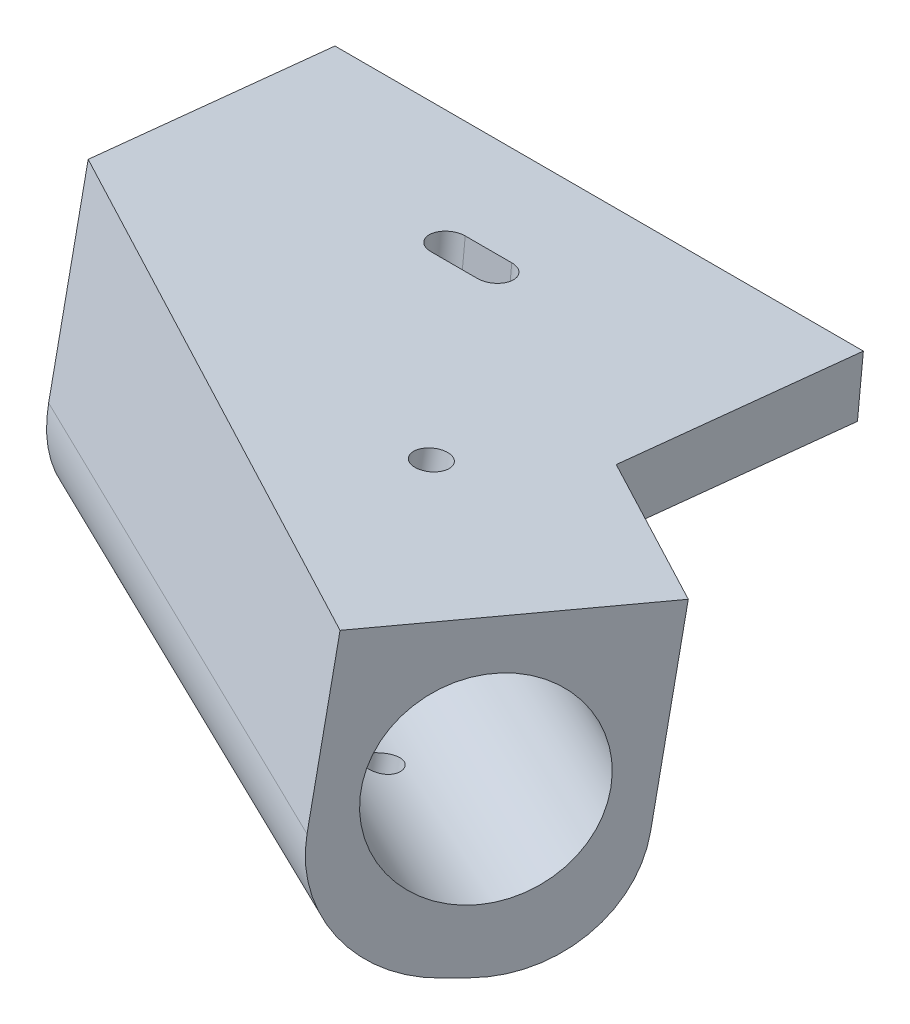
ISO-10303-21;
HEADER;
FILE_DESCRIPTION(('STEP AP214'),'2;1');
FILE_NAME('part.step','',(''),(''),'','','');
FILE_SCHEMA(('AUTOMOTIVE_DESIGN { 1 0 10303 214 1 1 1 1 }'));
ENDSEC;
DATA;
#1=APPLICATION_CONTEXT('core data for automotive mechanical design processes');
#2=APPLICATION_PROTOCOL_DEFINITION('international standard','automotive_design',2000,#1);
#3=PRODUCT_CONTEXT('',#1,'mechanical');
#4=PRODUCT('Part','Part','',(#3));
#5=PRODUCT_RELATED_PRODUCT_CATEGORY('part','',(#4));
#6=PRODUCT_DEFINITION_FORMATION('','',#4);
#7=PRODUCT_DEFINITION_CONTEXT('part definition',#1,'design');
#8=PRODUCT_DEFINITION('design','',#6,#7);
#9=PRODUCT_DEFINITION_SHAPE('','',#8);
#10=(LENGTH_UNIT() NAMED_UNIT(*) SI_UNIT(.MILLI.,.METRE.));
#11=(NAMED_UNIT(*) PLANE_ANGLE_UNIT() SI_UNIT($,.RADIAN.));
#12=(NAMED_UNIT(*) SI_UNIT($,.STERADIAN.) SOLID_ANGLE_UNIT());
#13=UNCERTAINTY_MEASURE_WITH_UNIT(LENGTH_MEASURE(1.E-05),#10,'distance_accuracy_value','');
#14=(GEOMETRIC_REPRESENTATION_CONTEXT(3) GLOBAL_UNCERTAINTY_ASSIGNED_CONTEXT((#13)) GLOBAL_UNIT_ASSIGNED_CONTEXT((#10,
#11,#12)) REPRESENTATION_CONTEXT('',''));
#15=CARTESIAN_POINT('',(0.,0.,0.));
#16=DIRECTION('',(0.,0.,1.));
#17=DIRECTION('',(1.,0.,0.));
#18=AXIS2_PLACEMENT_3D('',#15,#16,#17);
#19=CARTESIAN_POINT('',(32.8860228934979,-32.1671073067787,5.94942950250736));
#20=DIRECTION('',(-1.,0.,0.));
#21=DIRECTION('',(0.,0.202445469765825,0.979293537082368));
#22=AXIS2_PLACEMENT_3D('',#19,#20,#21);
#23=PLANE('',#22);
#24=DIRECTION('',(0.,0.101750830261066,0.994809915783505));
#25=VECTOR('',#24,1.);
#26=CARTESIAN_POINT('',(32.8860228934979,-3.35273767131856,0.34292364429795));
#27=LINE('',#26,#25);
#28=CARTESIAN_POINT('',(32.8860228934979,-2.93965703936323,4.38158070127646));
#29=VERTEX_POINT('',#28);
#30=CARTESIAN_POINT('',(32.8860228934979,-0.768702373713808,25.606834810391));
#31=VERTEX_POINT('',#30);
#32=EDGE_CURVE('E261',#29,#31,#27,.T.);
#33=ORIENTED_EDGE('',*,*,#32,.T.);
#34=DIRECTION('',(0.,0.979293537082368,-0.202445469765825));
#35=VECTOR('',#34,1.);
#36=CARTESIAN_POINT('',(32.8860228934979,-26.9831196043732,31.0260373374591));
#37=LINE('',#36,#35);
#38=CARTESIAN_POINT('',(32.8860228934979,-17.1901842335495,29.0015826398008));
#39=VERTEX_POINT('',#38);
#40=EDGE_CURVE('E331',#39,#31,#37,.T.);
#41=ORIENTED_EDGE('',*,*,#40,.F.);
#42=CARTESIAN_POINT('',(32.8860228934979,-14.8748820548213,40.2014403725721));
#43=DIRECTION('',(1.,0.,0.));
#44=DIRECTION('',(0.,0.202445469765825,0.979293537082368));
#45=AXIS2_PLACEMENT_3D('',#42,#43,#44);
#46=ELLIPSE('',#45,11.4366707311673,10.);
#47=CARTESIAN_POINT('',(32.8860228934979,-24.6678174256449,42.2258950702303));
#48=VERTEX_POINT('',#47);
#49=EDGE_CURVE('E459',#48,#39,#46,.T.);
#50=ORIENTED_EDGE('',*,*,#49,.F.);
#51=DIRECTION('',(0.,-0.202445469765825,-0.979293537082368));
#52=VECTOR('',#51,1.);
#53=CARTESIAN_POINT('',(32.8860228934979,-32.1671073067787,5.94942950250736));
#54=LINE('',#53,#52);
#55=CARTESIAN_POINT('',(32.8860228934979,-27.8092808682838,27.0296308618222));
#56=VERTEX_POINT('',#55);
#57=EDGE_CURVE('E324',#48,#56,#54,.T.);
#58=ORIENTED_EDGE('',*,*,#57,.T.);
#59=DIRECTION('',(0.,-0.994809915783505,0.101750830261066));
#60=VECTOR('',#59,1.);
#61=CARTESIAN_POINT('',(32.8860228934979,-4.25737810546047,24.6207026612445));
#62=LINE('',#61,#60);
#63=CARTESIAN_POINT('',(32.8860228934979,-5.87869001305944,24.7865331682519));
#64=VERTEX_POINT('',#63);
#65=EDGE_CURVE('E290',#64,#56,#62,.T.);
#66=ORIENTED_EDGE('',*,*,#65,.F.);
#67=DIRECTION('',(0.,0.101750830261066,0.994809915783505));
#68=VECTOR('',#67,1.);
#69=CARTESIAN_POINT('',(32.8860228934979,-8.32678725023608,0.851677795603279));
#70=LINE('',#69,#68);
#71=CARTESIAN_POINT('',(32.8860228934979,-7.91370661828075,4.89033485258179));
#72=VERTEX_POINT('',#71);
#73=EDGE_CURVE('E230',#72,#64,#70,.T.);
#74=ORIENTED_EDGE('',*,*,#73,.F.);
#75=DIRECTION('',(0.,-0.994809915783505,0.101750830261066));
#76=VECTOR('',#75,1.);
#77=CARTESIAN_POINT('',(32.8860228934979,80.6243758864512,-4.16548904065305));
#78=LINE('',#77,#76);
#79=EDGE_CURVE('E213',#29,#72,#78,.T.);
#80=ORIENTED_EDGE('',*,*,#79,.F.);
#81=EDGE_LOOP('',(#33,#41,#50,#58,#66,#74,#80));
#82=FACE_BOUND('',#81,.T.);
#83=ADVANCED_FACE('F102',(#82),#23,.F.);
#84=CARTESIAN_POINT('',(-12.5,-32.1671073067787,5.94942950250736));
#85=DIRECTION('',(-1.,0.,0.));
#86=DIRECTION('',(0.,0.202445469765825,0.979293537082368));
#87=AXIS2_PLACEMENT_3D('',#84,#85,#86);
#88=PLANE('',#87);
#89=DIRECTION('',(0.,-0.994809915783505,0.101750830261066));
#90=VECTOR('',#89,1.);
#91=CARTESIAN_POINT('',(-12.5,80.6243758864512,-4.16548904065305));
#92=LINE('',#91,#90);
#93=CARTESIAN_POINT('',(-12.5,-2.93965703936324,4.38158070127646));
#94=VERTEX_POINT('',#93);
#95=CARTESIAN_POINT('',(-12.5,-7.91370661828075,4.89033485258179));
#96=VERTEX_POINT('',#95);
#97=EDGE_CURVE('E212',#94,#96,#92,.T.);
#98=ORIENTED_EDGE('',*,*,#97,.T.);
#99=DIRECTION('',(0.,-0.101750830261066,-0.994809915783505));
#100=VECTOR('',#99,1.);
#101=CARTESIAN_POINT('',(-12.5,-8.05760323230686,3.48346890255901));
#102=LINE('',#101,#100);
#103=CARTESIAN_POINT('',(-12.5,-5.87869001305944,24.7865331682519));
#104=VERTEX_POINT('',#103);
#105=EDGE_CURVE('E221',#104,#96,#102,.T.);
#106=ORIENTED_EDGE('',*,*,#105,.F.);
#107=DIRECTION('',(0.,0.994809915783505,-0.101750830261066));
#108=VECTOR('',#107,1.);
#109=CARTESIAN_POINT('',(-12.5,-29.9881940875313,27.2524937682002));
#110=LINE('',#109,#108);
#111=CARTESIAN_POINT('',(-12.5,-25.247272851564,26.7675843756536));
#112=VERTEX_POINT('',#111);
#113=EDGE_CURVE('E229',#112,#104,#110,.T.);
#114=ORIENTED_EDGE('',*,*,#113,.F.);
#115=CARTESIAN_POINT('',(-12.5,-19.5108506111264,17.775776560197));
#116=DIRECTION('',(1.,0.,0.));
#117=DIRECTION('',(0.,-0.202445469765825,-0.979293537082368));
#118=AXIS2_PLACEMENT_3D('',#115,#116,#117);
#119=ELLIPSE('',#118,11.4366707311673,10.);
#120=CARTESIAN_POINT('',(-12.5,-17.1955484323982,28.9756342929683));
#121=VERTEX_POINT('',#120);
#122=EDGE_CURVE('E439',#121,#112,#119,.T.);
#123=ORIENTED_EDGE('',*,*,#122,.F.);
#124=DIRECTION('',(0.,0.979293537082368,-0.202445469765825));
#125=VECTOR('',#124,1.);
#126=CARTESIAN_POINT('',(-12.5,-26.9884838032219,31.0000889906265));
#127=LINE('',#126,#125);
#128=CARTESIAN_POINT('',(-12.5,-0.771412532034564,25.5803378042841));
#129=VERTEX_POINT('',#128);
#130=EDGE_CURVE('E328',#121,#129,#127,.T.);
#131=ORIENTED_EDGE('',*,*,#130,.T.);
#132=DIRECTION('',(0.,0.101750830261066,0.994809915783505));
#133=VECTOR('',#132,1.);
#134=CARTESIAN_POINT('',(-12.5,-3.35273767131856,0.34292364429795));
#135=LINE('',#134,#133);
#136=EDGE_CURVE('E236',#94,#129,#135,.T.);
#137=ORIENTED_EDGE('',*,*,#136,.F.);
#138=EDGE_LOOP('',(#98,#106,#114,#123,#131,#137));
#139=FACE_BOUND('',#138,.T.);
#140=ADVANCED_FACE('F233',(#139),#88,.T.);
#141=CARTESIAN_POINT('',(-13.7966008938304,-27.1341543230706,30.2954340591219));
#142=DIRECTION('',(-0.4852412054872,0.177014337935007,0.856275012284465));
#143=DIRECTION('',(0.87438033629384,0.0982348837945916,0.475193576459672));
#144=AXIS2_PLACEMENT_3D('',#141,#142,#143);
#145=PLANE('',#144);
#146=ORIENTED_EDGE('',*,*,#130,.F.);
#147=DIRECTION('',(-0.87438033629384,-0.0982348837945916,-0.475193576459672));
#148=VECTOR('',#147,1.);
#149=CARTESIAN_POINT('',(-13.7966008938304,-17.3412189522469,28.2709793614637));
#150=LINE('',#149,#148);
#151=CARTESIAN_POINT('',(36.1117302642888,-11.7341176621142,55.3943230527043));
#152=VERTEX_POINT('',#151);
#153=EDGE_CURVE('E456',#152,#121,#150,.T.);
#154=ORIENTED_EDGE('',*,*,#153,.F.);
#155=DIRECTION('',(0.,0.979293537082368,-0.202445469765825));
#156=VECTOR('',#155,1.);
#157=CARTESIAN_POINT('',(36.1117302642888,-21.5270530329379,57.4187777503626));
#158=LINE('',#157,#156);
#159=CARTESIAN_POINT('',(36.1117302642888,1.98787034741878,52.5576308827679));
#160=VERTEX_POINT('',#159);
#161=EDGE_CURVE('E339',#152,#160,#158,.T.);
#162=ORIENTED_EDGE('',*,*,#161,.T.);
#163=DIRECTION('',(0.873305406716937,0.0495702712943399,0.484644668600379));
#164=VECTOR('',#163,1.);
#165=CARTESIAN_POINT('',(-12.6344807988802,-0.779045886452259,25.5057070946777));
#166=LINE('',#165,#164);
#167=EDGE_CURVE('E281',#129,#160,#166,.T.);
#168=ORIENTED_EDGE('',*,*,#167,.F.);
#169=EDGE_LOOP('',(#146,#154,#162,#168));
#170=FACE_BOUND('',#169,.T.);
#171=ADVANCED_FACE('F409',(#170),#145,.T.);
#172=CARTESIAN_POINT('',(49.9083311581193,-26.560006016646,33.072773193748));
#173=DIRECTION('',(-0.87438033629384,-0.0982348837945916,-0.475193576459672));
#174=DIRECTION('',(-0.4852412054872,0.177014337935007,0.856275012284465));
#175=AXIS2_PLACEMENT_3D('',#172,#173,#174);
#176=PLANE('',#175);
#177=CARTESIAN_POINT('',(41.449383524648,-10.7433947681522,45.3679615082777));
#178=DIRECTION('',(-0.87438033629384,-0.0982348837945917,-0.475193576459672));
#179=DIRECTION('',(0.4852412054872,-0.177014337935007,-0.856275012284465));
#180=AXIS2_PLACEMENT_3D('',#177,#178,#179);
#181=CIRCLE('',#180,8.);
#182=CARTESIAN_POINT('',(45.3313131685456,-12.1595094716322,38.517761410002));
#183=VERTEX_POINT('',#182);
#184=EDGE_CURVE('E315',#183,#183,#181,.T.);
#185=ORIENTED_EDGE('',*,*,#184,.T.);
#186=EDGE_LOOP('',(#185));
#187=FACE_BOUND('',#186,.T.);
#188=DIRECTION('',(-0.483312222264139,0.0890775663773451,0.870904405189449));
#189=VECTOR('',#188,1.);
#190=CARTESIAN_POINT('',(48.7650808657222,-0.344223951406977,29.7569271729155));
#191=LINE('',#190,#189);
#192=CARTESIAN_POINT('',(46.7870367850072,0.0203423574518672,33.3212634843033));
#193=VERTEX_POINT('',#192);
#194=EDGE_CURVE('E278',#193,#160,#191,.T.);
#195=ORIENTED_EDGE('',*,*,#194,.T.);
#196=ORIENTED_EDGE('',*,*,#161,.F.);
#197=CARTESIAN_POINT('',(40.9641423191608,-13.5042610414643,46.8315729298596));
#198=DIRECTION('',(0.87438033629384,0.0982348837945916,0.475193576459672));
#199=DIRECTION('',(-0.4852412054872,0.177014337935007,0.856275012284465));
#200=AXIS2_PLACEMENT_3D('',#197,#198,#199);
#201=CIRCLE('',#200,10.);
#202=CARTESIAN_POINT('',(40.9641423191608,-23.2971964122879,48.8560276275179));
#203=VERTEX_POINT('',#202);
#204=EDGE_CURVE('E440',#203,#152,#201,.F.);
#205=ORIENTED_EDGE('',*,*,#204,.F.);
#206=DIRECTION('',(0.4852412054872,-0.177014337935007,-0.856275012284465));
#207=VECTOR('',#206,1.);
#208=CARTESIAN_POINT('',(49.9083311581193,-26.560006016646,33.072773193748));
#209=LINE('',#208,#207);
#210=CARTESIAN_POINT('',(41.9346247301352,-23.651225088158,47.1434776029489));
#211=VERTEX_POINT('',#210);
#212=EDGE_CURVE('E319',#203,#211,#209,.T.);
#213=ORIENTED_EDGE('',*,*,#212,.T.);
#214=CARTESIAN_POINT('',(41.9346247301352,-13.8582897173343,45.1190229052907));
#215=DIRECTION('',(0.87438033629384,0.0982348837945916,0.475193576459672));
#216=DIRECTION('',(-0.4852412054872,0.177014337935007,0.856275012284465));
#217=AXIS2_PLACEMENT_3D('',#214,#215,#216);
#218=CIRCLE('',#217,10.);
#219=CARTESIAN_POINT('',(46.7870367850072,-15.6284330966844,36.5562727824461));
#220=VERTEX_POINT('',#219);
#221=EDGE_CURVE('E432',#220,#211,#218,.F.);
#222=ORIENTED_EDGE('',*,*,#221,.F.);
#223=DIRECTION('',(0.,0.979293537082368,-0.202445469765825));
#224=VECTOR('',#223,1.);
#225=CARTESIAN_POINT('',(46.7870367850072,-25.421368467508,38.5807274801043));
#226=LINE('',#225,#224);
#227=EDGE_CURVE('E335',#220,#193,#226,.T.);
#228=ORIENTED_EDGE('',*,*,#227,.T.);
#229=EDGE_LOOP('',(#195,#196,#205,#213,#222,#228));
#230=FACE_BOUND('',#229,.T.);
#231=ADVANCED_FACE('F416',(#187,#230),#176,.F.);
#232=CARTESIAN_POINT('',(-3.12129437311202,-31.0284697576407,11.4573837888637));
#233=DIRECTION('',(-0.4852412054872,0.177014337935007,0.856275012284465));
#234=DIRECTION('',(0.87438033629384,0.0982348837945917,0.475193576459672));
#235=AXIS2_PLACEMENT_3D('',#232,#233,#234);
#236=PLANE('',#235);
#237=DIRECTION('',(0.873305406716937,0.0495702712943399,0.484644668600379));
#238=VECTOR('',#237,1.);
#239=CARTESIAN_POINT('',(-1.87400001915178,-2.74173924343288,6.3166075251006));
#240=LINE('',#239,#238);
#241=EDGE_CURVE('E275',#31,#193,#240,.T.);
#242=ORIENTED_EDGE('',*,*,#241,.T.);
#243=ORIENTED_EDGE('',*,*,#227,.F.);
#244=DIRECTION('',(-0.87438033629384,-0.0982348837945917,-0.475193576459672));
#245=VECTOR('',#244,1.);
#246=CARTESIAN_POINT('',(46.7870367850073,-15.6284330966844,36.5562727824461));
#247=LINE('',#246,#245);
#248=EDGE_CURVE('E435',#39,#220,#247,.F.);
#249=ORIENTED_EDGE('',*,*,#248,.F.);
#250=ORIENTED_EDGE('',*,*,#40,.T.);
#251=EDGE_LOOP('',(#242,#243,#249,#250));
#252=FACE_BOUND('',#251,.T.);
#253=ADVANCED_FACE('F413',(#252),#236,.F.);
#254=CARTESIAN_POINT('',(25.4666104281439,10.9640174975764,31.8232204747472));
#255=DIRECTION('',(0.,-0.979293537082368,0.202445469765825));
#256=DIRECTION('',(0.,0.202445469765825,0.979293537082368));
#257=AXIS2_PLACEMENT_3D('',#254,#255,#256);
#258=CYLINDRICAL_SURFACE('',#257,1.4);
#259=CARTESIAN_POINT('',(25.4666104281439,-4.51351566264441,36.4524315333062));
#260=CARTESIAN_POINT('',(25.3888690029519,-4.51923541028958,36.4536112408978));
#261=CARTESIAN_POINT('',(25.3110447879543,-4.52568252216547,36.4483154232182));
#262=CARTESIAN_POINT('',(25.1574172570725,-4.53942452311229,36.4247566637036));
#263=CARTESIAN_POINT('',(25.0816154074309,-4.54672000777493,36.4064845654773));
#264=CARTESIAN_POINT('',(24.9342135941386,-4.56166637750988,36.3573762516521));
#265=CARTESIAN_POINT('',(24.8626141919792,-4.56931730983018,36.3265383614832));
#266=CARTESIAN_POINT('',(24.725712792616,-4.58464748765323,36.2531510865379));
#267=CARTESIAN_POINT('',(24.6604097000422,-4.592326727989,36.2106037438393));
#268=CARTESIAN_POINT('',(24.5383354090472,-4.60753828714821,36.1153503024272));
#269=CARTESIAN_POINT('',(24.4815138156864,-4.61507122174486,36.0627088338262));
#270=CARTESIAN_POINT('',(24.3774773562785,-4.63009888298748,35.9486575032017));
#271=CARTESIAN_POINT('',(24.3302632396606,-4.63759360660838,35.8872469577835));
#272=CARTESIAN_POINT('',(24.2463684522958,-4.6528142844096,35.756945179514));
#273=CARTESIAN_POINT('',(24.2097735542816,-4.66054159367429,35.6879989059906));
#274=CARTESIAN_POINT('',(24.1485778572513,-4.67648324084597,35.5450245770534));
#275=CARTESIAN_POINT('',(24.1239780610326,-4.68469761940785,35.4709960973543));
#276=CARTESIAN_POINT('',(24.0871946290021,-4.70206622655803,35.3189921313052));
#277=CARTESIAN_POINT('',(24.0751753358094,-4.71123121674638,35.240978035087));
#278=CARTESIAN_POINT('',(24.0644799477519,-4.7307196860457,35.0841810466736));
#279=CARTESIAN_POINT('',(24.0658036620954,-4.74104314858958,35.0053981654873));
#280=CARTESIAN_POINT('',(24.0817908361318,-4.76301772090585,34.8495366214618));
#281=CARTESIAN_POINT('',(24.0964286834333,-4.77466624403088,34.7724549774527));
#282=CARTESIAN_POINT('',(24.1386370994661,-4.79931580595603,34.622146467107));
#283=CARTESIAN_POINT('',(24.1662064491943,-4.81231671718185,34.548919238153));
#284=CARTESIAN_POINT('',(24.2330421872969,-4.83927874711554,34.4094542221637));
#285=CARTESIAN_POINT('',(24.2721464780163,-4.85322462176164,34.3431357608631));
#286=CARTESIAN_POINT('',(24.3610538382344,-4.88180965843443,34.2182794978588));
#287=CARTESIAN_POINT('',(24.4108566337147,-4.89644880269707,34.1597414969382));
#288=CARTESIAN_POINT('',(24.5194900209297,-4.92574617273548,34.0522725040176));
#289=CARTESIAN_POINT('',(24.5782824142269,-4.94040406905396,34.0033027715406));
#290=CARTESIAN_POINT('',(24.7033877500156,-4.96904820214414,33.9159098889856));
#291=CARTESIAN_POINT('',(24.7697012367136,-4.98303439020846,33.8774875027745));
#292=CARTESIAN_POINT('',(24.9088201571713,-5.00964542499931,33.8117250214003));
#293=CARTESIAN_POINT('',(24.981690963235,-5.02225294079198,33.7845162150082));
#294=CARTESIAN_POINT('',(25.1312757673971,-5.0450270188976,33.742423163848));
#295=CARTESIAN_POINT('',(25.207990033173,-5.05519341091224,33.7275397787518));
#296=CARTESIAN_POINT('',(25.3639361586117,-5.07231983774783,33.7103158334795));
#297=CARTESIAN_POINT('',(25.4431852549858,-5.07924770131713,33.7080987651855));
#298=CARTESIAN_POINT('',(25.6012512775661,-5.0890070042556,33.7165332116505));
#299=CARTESIAN_POINT('',(25.6800682267512,-5.09183866357991,33.7271840353819));
#300=CARTESIAN_POINT('',(25.8344495394047,-5.09288276196664,33.7608905040658));
#301=CARTESIAN_POINT('',(25.910033096405,-5.09112801235073,33.7838571056994));
#302=CARTESIAN_POINT('',(26.0563349480998,-5.08285627228757,33.8414573416598));
#303=CARTESIAN_POINT('',(26.1270536873803,-5.07633971764655,33.8760899081469));
#304=CARTESIAN_POINT('',(26.2606680726947,-5.05879591002937,33.9554760923534));
#305=CARTESIAN_POINT('',(26.323654319168,-5.04782906475659,34.0000907115846));
#306=CARTESIAN_POINT('',(26.4410989513627,-5.02185119401303,34.0984322959918));
#307=CARTESIAN_POINT('',(26.4955572151439,-5.00684011072275,34.1521593914427));
#308=CARTESIAN_POINT('',(26.5945335940939,-4.97349605599359,34.267347568976));
#309=CARTESIAN_POINT('',(26.6390362488292,-4.95515799684754,34.3288204515378));
#310=CARTESIAN_POINT('',(26.7168215047837,-4.91613841992656,34.45782381923));
#311=CARTESIAN_POINT('',(26.7501031215183,-4.89545669674138,34.5253548352167));
#312=CARTESIAN_POINT('',(26.8049525178785,-4.85254782606972,34.6657220167512));
#313=CARTESIAN_POINT('',(26.8263524963752,-4.8303033048629,34.7386184815316));
#314=CARTESIAN_POINT('',(26.8561376764425,-4.78571546361696,34.8869979143445));
#315=CARTESIAN_POINT('',(26.8645224239256,-4.76337214015802,34.9624809725264));
#316=CARTESIAN_POINT('',(26.8680182069458,-4.71964074571061,35.1144198903215));
#317=CARTESIAN_POINT('',(26.8630667534125,-4.69825765076552,35.1908786530492));
#318=CARTESIAN_POINT('',(26.839843777939,-4.65762268148988,35.3423257636647));
#319=CARTESIAN_POINT('',(26.8215733353336,-4.63837063461058,35.4173142301957));
#320=CARTESIAN_POINT('',(26.7724815783239,-4.60306695173008,35.5628594276925));
#321=CARTESIAN_POINT('',(26.7418052093067,-4.58698144146532,35.6334568279815));
#322=CARTESIAN_POINT('',(26.6687803056013,-4.55832791160076,35.7691055683943));
#323=CARTESIAN_POINT('',(26.6264328152624,-4.54575957748149,35.8341574040618));
#324=CARTESIAN_POINT('',(26.5317673912658,-4.52453465559198,35.9562305638363));
#325=CARTESIAN_POINT('',(26.4795500909632,-4.51584132833253,36.0133236227718));
#326=CARTESIAN_POINT('',(26.3663663339062,-4.50218200888213,36.1186061271328));
#327=CARTESIAN_POINT('',(26.3053980228163,-4.49721680807265,36.1667936805222));
#328=CARTESIAN_POINT('',(26.1759733291412,-4.49073300323869,36.2531905464557));
#329=CARTESIAN_POINT('',(26.1074667748154,-4.48923916275843,36.2913264557757));
#330=CARTESIAN_POINT('',(25.9652418821466,-4.48930285324894,36.356037100343));
#331=CARTESIAN_POINT('',(25.8915274232894,-4.49085813548726,36.3826203380389));
#332=CARTESIAN_POINT('',(25.7592054877942,-4.49573696126923,36.4184796732863));
#333=CARTESIAN_POINT('',(25.7012773285257,-4.498539278171,36.4303911726223));
#334=CARTESIAN_POINT('',(25.5844521237835,-4.50526022936592,36.446919885565));
#335=CARTESIAN_POINT('',(25.5255550734227,-4.50917886929136,36.4515370623681));
#336=CARTESIAN_POINT('',(25.4666104281439,-4.51351566264441,36.4524315333062));
#337=B_SPLINE_CURVE_WITH_KNOTS('',3,(#259,#260,#261,#262,#263,#264,#265,#266,#267,#268,#269,
#270,#271,#272,#273,#274,#275,#276,#277,#278,#279,#280,#281,#282,#283,#284,#285,#286,#287,#288,
#289,#290,#291,#292,#293,#294,#295,#296,#297,#298,#299,#300,#301,#302,#303,#304,#305,#306,#307,
#308,#309,#310,#311,#312,#313,#314,#315,#316,#317,#318,#319,#320,#321,#322,#323,#324,#325,#326,
#327,#328,#329,#330,#331,#332,#333,#334,#335,#336),.UNSPECIFIED.,.T.,.F.,(4,2,2,2,2,2,2,2,2,2,2,
2,2,2,2,2,2,2,2,2,2,2,2,2,2,2,2,2,2,2,2,2,2,2,2,2,2,2,4),(0.,0.233671709064821,
0.467508466829698,0.701376396854929,0.935203567143381,1.16758078348282,1.39997611941518,
1.63419938067458,1.86844221977515,2.10570823629654,2.34297086015518,2.57977802510527,
2.81656287163774,3.05016705262569,3.2837652510775,3.51639710126793,3.74904579483375,
3.98434585237587,4.21966232021563,4.45726917173897,4.69486326394018,4.93076226032884,
5.1666396696565,5.39941704619646,5.63219775087535,5.86533747790991,6.09849765428409,
6.33487197145752,6.57125453528921,6.80874663497085,7.04621949107493,7.28099447805726,
7.51574846383997,7.74822673730607,7.98075434574797,8.21493570411591,8.44894441836004,
8.62611671065889,8.80328989687871),.UNSPECIFIED.);
#338=CARTESIAN_POINT('',(25.4666104281439,-4.51351566264441,36.4524315333062));
#339=VERTEX_POINT('',#338);
#340=EDGE_CURVE('E320',#339,#339,#337,.T.);
#341=ORIENTED_EDGE('',*,*,#340,.T.);
#342=EDGE_LOOP('',(#341));
#343=FACE_BOUND('',#342,.T.);
#344=CARTESIAN_POINT('',(25.4666104281439,0.0968974970498894,34.0697371014807));
#345=DIRECTION('',(0.,-0.994809915783505,0.101750830261066));
#346=DIRECTION('',(0.,0.101750830261066,0.994809915783505));
#347=AXIS2_PLACEMENT_3D('',#344,#345,#346);
#348=ELLIPSE('',#347,1.40730402641531,1.4);
#349=CARTESIAN_POINT('',(25.4666104281439,0.240091850167388,35.4697371014807));
#350=VERTEX_POINT('',#349);
#351=EDGE_CURVE('E358',#350,#350,#348,.F.);
#352=ORIENTED_EDGE('',*,*,#351,.T.);
#353=EDGE_LOOP('',(#352));
#354=FACE_BOUND('',#353,.T.);
#355=ADVANCED_FACE('F401',(#343,#354),#258,.F.);
#356=CARTESIAN_POINT('',(-11.8878169892762,-16.7357226796223,16.3811533442377));
#357=DIRECTION('',(0.87438033629384,0.0982348837945916,0.475193576459672));
#358=DIRECTION('',(0.4852412054872,-0.177014337935007,-0.856275012284465));
#359=AXIS2_PLACEMENT_3D('',#356,#357,#358);
#360=CYLINDRICAL_SURFACE('',#359,8.);
#361=CARTESIAN_POINT('',(18.0159905119731,-13.3760896538472,32.6327736591585));
#362=DIRECTION('',(-0.87438033629384,-0.0982348837945916,-0.475193576459672));
#363=DIRECTION('',(0.4852412054872,-0.177014337935007,-0.856275012284465));
#364=AXIS2_PLACEMENT_3D('',#361,#362,#363);
#365=CIRCLE('',#364,8.);
#366=CARTESIAN_POINT('',(21.8979201558707,-14.7922043573273,25.7825735608828));
#367=VERTEX_POINT('',#366);
#368=EDGE_CURVE('E218',#367,#367,#365,.T.);
#369=ORIENTED_EDGE('',*,*,#368,.T.);
#370=EDGE_LOOP('',(#369));
#371=FACE_BOUND('',#370,.T.);
#372=ORIENTED_EDGE('',*,*,#340,.F.);
#373=EDGE_LOOP('',(#372));
#374=FACE_BOUND('',#373,.T.);
#375=CARTESIAN_POINT('',(25.4666104281439,-19.9976918068122,39.6534138687785));
#376=CARTESIAN_POINT('',(25.5455360096971,-20.0035000836216,39.6546116251586));
#377=CARTESIAN_POINT('',(25.6244588782142,-20.0112723646292,39.6493856790696));
#378=CARTESIAN_POINT('',(25.7800660277939,-20.0299756998351,39.6261280745018));
#379=CARTESIAN_POINT('',(25.8567479430335,-20.0409099683571,39.6080833577543));
#380=CARTESIAN_POINT('',(26.0056760503502,-20.0650404512151,39.5595682115897));
#381=CARTESIAN_POINT('',(26.0779237787672,-20.0782358760366,39.5291021141675));
#382=CARTESIAN_POINT('',(26.2159666695225,-20.1059690722625,39.4564564791837));
#383=CARTESIAN_POINT('',(26.281763447442,-20.1205065057933,39.4142798845999));
#384=CARTESIAN_POINT('',(26.4048580759946,-20.1500105514807,39.3194017973301));
#385=CARTESIAN_POINT('',(26.4621796451915,-20.1649758204402,39.2667306843378));
#386=CARTESIAN_POINT('',(26.5668574816727,-20.1946206239323,39.1522042181771));
#387=CARTESIAN_POINT('',(26.6142143282513,-20.2093001750298,39.0903493992559));
#388=CARTESIAN_POINT('',(26.6969909590971,-20.2376001125642,38.9601101119579));
#389=CARTESIAN_POINT('',(26.7325631307883,-20.251232114157,38.891824965253));
#390=CARTESIAN_POINT('',(26.7916264398189,-20.2773001348743,38.7500066891399));
#391=CARTESIAN_POINT('',(26.8151178373773,-20.2897361797549,38.6764736728093));
#392=CARTESIAN_POINT('',(26.8493330755905,-20.3132374212646,38.5265470210646));
#393=CARTESIAN_POINT('',(26.8600979648085,-20.324306921558,38.4501634070078));
#394=CARTESIAN_POINT('',(26.8687527030303,-20.3451841110949,38.2964999856667));
#395=CARTESIAN_POINT('',(26.8666415994046,-20.3549917069217,38.2192201124949));
#396=CARTESIAN_POINT('',(26.8495403927596,-20.3736693458469,38.0650411315547));
#397=CARTESIAN_POINT('',(26.8343977405733,-20.3825268808076,37.9881574272853));
#398=CARTESIAN_POINT('',(26.7914586118041,-20.3994888937503,37.8379179197149));
#399=CARTESIAN_POINT('',(26.7636612954711,-20.407593321714,37.7645623508945));
#400=CARTESIAN_POINT('',(26.6958462795323,-20.4234669982308,37.6228620510622));
#401=CARTESIAN_POINT('',(26.6557202415322,-20.4312325487904,37.5545686872786));
#402=CARTESIAN_POINT('',(26.5644279318782,-20.4466556408345,37.4257941905328));
#403=CARTESIAN_POINT('',(26.513262327428,-20.4543131888165,37.3653125858005));
#404=CARTESIAN_POINT('',(26.4017684955276,-20.4696442231869,37.2544621583158));
#405=CARTESIAN_POINT('',(26.3415164102491,-20.477317097984,37.204016701434));
#406=CARTESIAN_POINT('',(26.2132794887721,-20.4927453629418,37.1141827714083));
#407=CARTESIAN_POINT('',(26.1452953334404,-20.5005007457826,37.0747933257575));
#408=CARTESIAN_POINT('',(26.0044891101524,-20.5158006678802,37.0086580533766));
#409=CARTESIAN_POINT('',(25.9317400613917,-20.5233466352092,36.9817569208015));
#410=CARTESIAN_POINT('',(25.7827121807388,-20.537955020339,36.9405609763303));
#411=CARTESIAN_POINT('',(25.7064332784039,-20.5450174284828,36.926266416128));
#412=CARTESIAN_POINT('',(25.5522865678307,-20.5581502981529,36.9105464545297));
#413=CARTESIAN_POINT('',(25.4744152442438,-20.5642182187859,36.9091535280771));
#414=CARTESIAN_POINT('',(25.3193942889667,-20.5747168356899,36.9192142721951));
#415=CARTESIAN_POINT('',(25.2422447223015,-20.5791473858045,36.9306690892239));
#416=CARTESIAN_POINT('',(25.0896843263097,-20.5857625164969,36.9662280640354));
#417=CARTESIAN_POINT('',(25.0143124200371,-20.5879151145371,36.9905053531528));
#418=CARTESIAN_POINT('',(24.8685075471502,-20.5892265466249,37.0510311223862));
#419=CARTESIAN_POINT('',(24.7980747144101,-20.5883852995561,37.0872799268391));
#420=CARTESIAN_POINT('',(24.6638637629612,-20.5831818762529,37.1708249078075));
#421=CARTESIAN_POINT('',(24.6001117379805,-20.5788064359193,37.218162224314));
#422=CARTESIAN_POINT('',(24.4814240549179,-20.5661953143193,37.3224075980151));
#423=CARTESIAN_POINT('',(24.4264876465906,-20.5579599617814,37.3793148399244));
#424=CARTESIAN_POINT('',(24.3276528582735,-20.5376970758043,37.5002887283079));
#425=CARTESIAN_POINT('',(24.2836313366143,-20.5257156588035,37.5642624964159));
#426=CARTESIAN_POINT('',(24.2070770418036,-20.4981772136473,37.6980448713052));
#427=CARTESIAN_POINT('',(24.1745435920489,-20.4826203961585,37.7678531341577));
#428=CARTESIAN_POINT('',(24.1221245963165,-20.4486259381834,37.9106553282134));
#429=CARTESIAN_POINT('',(24.102128551663,-20.4302153025774,37.9836151904366));
#430=CARTESIAN_POINT('',(24.0748436356077,-20.3911919306943,38.1312991492017));
#431=CARTESIAN_POINT('',(24.0675553908669,-20.3705790858726,38.2060233325635));
#432=CARTESIAN_POINT('',(24.0658313672584,-20.3279581241088,38.355830390963));
#433=CARTESIAN_POINT('',(24.0714932990151,-20.3059406261899,38.4309116992463));
#434=CARTESIAN_POINT('',(24.0956793678916,-20.2617613724576,38.5789322177987));
#435=CARTESIAN_POINT('',(24.1142046299321,-20.2395996041954,38.6518712401396));
#436=CARTESIAN_POINT('',(24.1639269203082,-20.1960130596113,38.7946603667945));
#437=CARTESIAN_POINT('',(24.1952817481497,-20.1746012022219,38.864459535819));
#438=CARTESIAN_POINT('',(24.2698191552772,-20.1339852222911,38.9981344037682));
#439=CARTESIAN_POINT('',(24.3130012807066,-20.1147810150743,39.0620103298635));
#440=CARTESIAN_POINT('',(24.4099316498361,-20.0796590331415,39.1820114661678));
#441=CARTESIAN_POINT('',(24.4636610359198,-20.0637354955092,39.2381502092782));
#442=CARTESIAN_POINT('',(24.5802346705441,-20.0359643173784,39.3412400428211));
#443=CARTESIAN_POINT('',(24.6430796225692,-20.0241169916955,39.3881904234935));
#444=CARTESIAN_POINT('',(24.7751470359816,-20.0051659468155,39.4709690013158));
#445=CARTESIAN_POINT('',(24.8442723187902,-19.9980005516248,39.5069383378237));
#446=CARTESIAN_POINT('',(24.9875776125949,-19.9883490634968,39.5675419575834));
#447=CARTESIAN_POINT('',(25.061753011484,-19.9858587588104,39.5921864281761));
#448=CARTESIAN_POINT('',(25.1912698520633,-19.9854519249558,39.6241083832209));
#449=CARTESIAN_POINT('',(25.2459025160313,-19.9864272678002,39.6343408439804));
#450=CARTESIAN_POINT('',(25.3558940370474,-19.9905102696656,39.6485735652842));
#451=CARTESIAN_POINT('',(25.4112528999298,-19.993617945828,39.6525737757275));
#452=CARTESIAN_POINT('',(25.4666104281439,-19.9976918068122,39.6534138687785));
#453=B_SPLINE_CURVE_WITH_KNOTS('',3,(#375,#376,#377,#378,#379,#380,#381,#382,#383,#384,#385,
#386,#387,#388,#389,#390,#391,#392,#393,#394,#395,#396,#397,#398,#399,#400,#401,#402,#403,#404,
#405,#406,#407,#408,#409,#410,#411,#412,#413,#414,#415,#416,#417,#418,#419,#420,#421,#422,#423,
#424,#425,#426,#427,#428,#429,#430,#431,#432,#433,#434,#435,#436,#437,#438,#439,#440,#441,#442,
#443,#444,#445,#446,#447,#448,#449,#450,#451,#452),.UNSPECIFIED.,.T.,.F.,(4,2,2,2,2,2,2,2,2,2,2,
2,2,2,2,2,2,2,2,2,2,2,2,2,2,2,2,2,2,2,2,2,2,2,2,2,2,2,4),(0.,0.237242087508302,
0.474726196786988,0.712127553498576,0.949469302533297,1.18613372026463,1.42278437582006,
1.65624318110834,1.8896969574992,2.12239567081674,2.35511160054175,2.59058937661682,
2.82608278102457,3.06370781467119,3.3013184908799,3.53703860160662,3.77273797145924,
4.00542198785671,4.23811064975432,4.47138485794833,4.70467988383702,4.94120860462125,
5.17774373405974,5.41517074581319,5.65257754081916,5.88716971579792,6.12174807189456,
6.35422878022977,6.58672095258623,6.82097308720113,7.05524571015415,7.29249083082038,
7.52972684880289,7.76654250971211,8.00337645636161,8.23702403921637,8.47046102976485,
8.63685866305937,8.80325763401862),.UNSPECIFIED.);
#454=CARTESIAN_POINT('',(25.4666104281439,-19.9976918068122,39.6534138687785));
#455=VERTEX_POINT('',#454);
#456=EDGE_CURVE('E301',#455,#455,#453,.T.);
#457=ORIENTED_EDGE('',*,*,#456,.F.);
#458=EDGE_LOOP('',(#457));
#459=FACE_BOUND('',#458,.T.);
#460=ORIENTED_EDGE('',*,*,#184,.F.);
#461=EDGE_LOOP('',(#460));
#462=FACE_BOUND('',#461,.T.);
#463=ADVANCED_FACE('F510',(#371,#374,#459,#462),#360,.F.);
#464=CARTESIAN_POINT('',(-8.94418883895844,-19.111362331597,19.708229238619));
#465=DIRECTION('',(-0.87438033629384,-0.0982348837945916,-0.475193576459672));
#466=DIRECTION('',(-0.4852412054872,0.177014337935007,0.856275012284465));
#467=AXIS2_PLACEMENT_3D('',#464,#465,#466);
#468=CYLINDRICAL_SURFACE('',#467,10.);
#469=DIRECTION('',(-0.87438033629384,-0.0982348837945916,-0.475193576459672));
#470=VECTOR('',#469,1.);
#471=CARTESIAN_POINT('',(-8.94418883895844,-28.9042977024206,21.7326839362773));
#472=LINE('',#471,#470);
#473=CARTESIAN_POINT('',(0.802462764783535,-27.8092808682838,27.0296308618222));
#474=VERTEX_POINT('',#473);
#475=CARTESIAN_POINT('',(24.1246549566395,-25.1890791726316,39.7043851518174));
#476=VERTEX_POINT('',#475);
#477=EDGE_CURVE('E353',#474,#476,#472,.F.);
#478=ORIENTED_EDGE('',*,*,#477,.T.);
#479=CARTESIAN_POINT('',(24.1246549566395,-25.1890791726316,39.7043851518174));
#480=CARTESIAN_POINT('',(24.1313799366683,-25.1844990965286,39.7265411391824));
#481=CARTESIAN_POINT('',(24.1385973936478,-25.1799077748869,39.7485479441132));
#482=CARTESIAN_POINT('',(24.1539251436374,-25.1708011424008,39.7918516478176));
#483=CARTESIAN_POINT('',(24.1620192621039,-25.1662857933862,39.8131542715277));
#484=CARTESIAN_POINT('',(24.1791001164195,-25.1573450129807,39.8550531343552));
#485=CARTESIAN_POINT('',(24.1880725576176,-25.1529192148044,39.8756551075308));
#486=CARTESIAN_POINT('',(24.2069077179875,-25.144170859207,39.9161550048854));
#487=CARTESIAN_POINT('',(24.2167582851689,-25.1398477007997,39.9360584438846));
#488=CARTESIAN_POINT('',(24.2373475570342,-25.1313167446339,39.9751640859588));
#489=CARTESIAN_POINT('',(24.2480764343894,-25.1271082266321,39.9943713000951));
#490=CARTESIAN_POINT('',(24.2704198533337,-25.1188176196769,40.0320873669813));
#491=CARTESIAN_POINT('',(24.2820270197463,-25.1147348114945,40.050600427323));
#492=CARTESIAN_POINT('',(24.3061244431412,-25.1067055964194,40.0869312377111));
#493=CARTESIAN_POINT('',(24.3186098291449,-25.1027585939162,40.1047520852432));
#494=CARTESIAN_POINT('',(24.3444610631164,-25.0950098801365,40.1397016556332));
#495=CARTESIAN_POINT('',(24.3578245159874,-25.0912078149506,40.1568320711626));
#496=CARTESIAN_POINT('',(24.3854293020811,-25.0837567897957,40.1904040763715));
#497=CARTESIAN_POINT('',(24.3996706060652,-25.0801078247341,40.2068456889624));
#498=CARTESIAN_POINT('',(24.4290286459279,-25.0729697543122,40.2390434520047));
#499=CARTESIAN_POINT('',(24.4441475323038,-25.0694810827126,40.2547977373089));
#500=CARTESIAN_POINT('',(24.4752585033256,-25.0626693152238,40.28562421405));
#501=CARTESIAN_POINT('',(24.4912546675286,-25.0593471599692,40.3006924941707));
#502=CARTESIAN_POINT('',(24.524118239667,-25.0528731285251,40.3301502598208));
#503=CARTESIAN_POINT('',(24.5409913572345,-25.0497227426069,40.344533698638));
#504=CARTESIAN_POINT('',(24.5756072136483,-25.0435959674764,40.3726249382367));
#505=CARTESIAN_POINT('',(24.5933569639754,-25.0406216344189,40.3863245396231));
#506=CARTESIAN_POINT('',(24.6297248002113,-25.0348497284562,40.4130510240679));
#507=CARTESIAN_POINT('',(24.6483508612587,-25.0320547681201,40.4260676068084));
#508=CARTESIAN_POINT('',(24.6864704581295,-25.0266434302261,40.4514307261752));
#509=CARTESIAN_POINT('',(24.705972603973,-25.0240301887645,40.4637649757478));
#510=CARTESIAN_POINT('',(24.7458436084079,-25.0189832427581,40.4877655574865));
#511=CARTESIAN_POINT('',(24.7662214017381,-25.0165531462493,40.4994177769534));
#512=CARTESIAN_POINT('',(24.8074936707436,-25.01191182569,40.5218660699706));
#513=CARTESIAN_POINT('',(24.8283886323329,-25.0097008180631,40.5326612948997));
#514=CARTESIAN_POINT('',(24.8703217525643,-25.005549418336,40.5531504073561));
#515=CARTESIAN_POINT('',(24.8913522547047,-25.0036052584106,40.5628591678117));
#516=CARTESIAN_POINT('',(24.9335548500696,-24.999985884557,40.5811758361011));
#517=CARTESIAN_POINT('',(24.9547207182391,-24.9983072511846,40.5897973891464));
#518=CARTESIAN_POINT('',(24.9971926682,-24.9952161667971,40.605940453608));
#519=CARTESIAN_POINT('',(25.0184939363353,-24.9938007344673,40.6134740380514));
#520=CARTESIAN_POINT('',(25.0612352913178,-24.9912322622994,40.6274420386533));
#521=CARTESIAN_POINT('',(25.0826719023341,-24.9900767577438,40.6338866215515));
#522=CARTESIAN_POINT('',(25.125682667209,-24.988023320047,40.6456776186043));
#523=CARTESIAN_POINT('',(25.1472545485157,-24.9871235017848,40.6510319829319));
#524=CARTESIAN_POINT('',(25.190534734934,-24.9855756048092,40.6606436245596));
#525=CARTESIAN_POINT('',(25.2122417792781,-24.9849262629619,40.6649063691964));
#526=CARTESIAN_POINT('',(25.2557913883528,-24.9838724956427,40.6723358969194));
#527=CARTESIAN_POINT('',(25.2776334634187,-24.983467446977,40.6755054597906));
#528=CARTESIAN_POINT('',(25.3214524873113,-24.9828944756186,40.6807497324782));
#529=CARTESIAN_POINT('',(25.3434294406108,-24.9827265608326,40.682824405786));
#530=CARTESIAN_POINT('',(25.3875178600204,-24.9826191248106,40.6858799204198));
#531=CARTESIAN_POINT('',(25.4096295279778,-24.9826802065192,40.6868578652777));
#532=CARTESIAN_POINT('',(25.4539873070239,-24.9830211137259,40.6877207782708));
#533=CARTESIAN_POINT('',(25.4762335191059,-24.9833020755227,40.6876000340416));
#534=CARTESIAN_POINT('',(25.5208606098862,-24.9840721982183,40.686266187278));
#535=CARTESIAN_POINT('',(25.5432412072021,-24.9845629449422,40.6850446842191));
#536=CARTESIAN_POINT('',(25.5881375078496,-24.985741214746,40.6815096146862));
#537=CARTESIAN_POINT('',(25.6106522979245,-24.9864306721268,40.6791851605661));
#538=CARTESIAN_POINT('',(25.655817773942,-24.9879940783553,40.6734441759397));
#539=CARTESIAN_POINT('',(25.6784667116093,-24.9888701975539,40.6700145311157));
#540=CARTESIAN_POINT('',(25.7239008823101,-24.9907937726152,40.6620625411665));
#541=CARTESIAN_POINT('',(25.7466833715392,-24.9918435168753,40.6575251531337));
#542=CARTESIAN_POINT('',(25.7923871943835,-24.9941003701592,40.647357438987));
#543=CARTESIAN_POINT('',(25.8153047216137,-24.9953097686764,40.641710477778));
#544=CARTESIAN_POINT('',(25.8380834886739,-24.9965789004409,40.635570584917));
#545=B_SPLINE_CURVE_WITH_KNOTS('',3,(#479,#480,#481,#482,#483,#484,#485,#486,#487,#488,#489,
#490,#491,#492,#493,#494,#495,#496,#497,#498,#499,#500,#501,#502,#503,#504,#505,#506,#507,#508,
#509,#510,#511,#512,#513,#514,#515,#516,#517,#518,#519,#520,#521,#522,#523,#524,#525,#526,#527,
#528,#529,#530,#531,#532,#533,#534,#535,#536,#537,#538,#539,#540,#541,#542,#543,#544),
.UNSPECIFIED.,.F.,.F.,(4,2,2,2,2,2,2,2,2,2,2,2,2,2,2,2,2,2,2,2,2,2,2,2,2,2,2,2,2,2,2,2,4),(0.,
0.0708062741567146,0.140477033899188,0.209159251829968,0.27700632528927,0.344177373659343,
0.410836357818675,0.477151037098518,0.543291790909378,0.609430342952233,0.675738434149239,
0.742386494913142,0.809542367433349,0.877370124279605,0.946029021487098,1.01567261358666,
1.08644804623783,1.1572927105747,1.22700244394925,1.29572476680498,1.36361363670123,
1.43082873852163,1.49753459599941,1.56389952027098,1.63009442306889,1.69629153295288,
1.76266306118576,1.82937986827436,1.89661018213827,1.96451841434405,2.03326411255374,
2.10300107649973,2.17387665289024),.UNSPECIFIED.);
#546=CARTESIAN_POINT('',(25.8380834886739,-24.9965789004409,40.635570584917));
#547=VERTEX_POINT('',#546);
#548=EDGE_CURVE('E462',#476,#547,#545,.T.);
#549=ORIENTED_EDGE('',*,*,#548,.T.);
#550=EDGE_CURVE('E343',#547,#203,#472,.F.);
#551=ORIENTED_EDGE('',*,*,#550,.T.);
#552=ORIENTED_EDGE('',*,*,#204,.T.);
#553=ORIENTED_EDGE('',*,*,#153,.T.);
#554=ORIENTED_EDGE('',*,*,#122,.T.);
#555=CARTESIAN_POINT('',(2.64552739824241,-17.8092808682838,26.00681405384));
#556=DIRECTION('',(0.,0.101750830261066,0.994809915783505));
#557=DIRECTION('',(-0.998409537429802,-0.0560846583676311,0.00573643312483487));
#558=AXIS2_PLACEMENT_3D('',#555,#556,#557);
#559=ELLIPSE('',#558,20.7158244262448,10.);
#560=EDGE_CURVE('E357',#474,#112,#559,.F.);
#561=ORIENTED_EDGE('',*,*,#560,.F.);
#562=EDGE_LOOP('',(#478,#549,#551,#552,#553,#554,#561));
#563=FACE_BOUND('',#562,.T.);
#564=ADVANCED_FACE('F104',(#563),#468,.T.);
#565=CARTESIAN_POINT('',(0.,-32.1671073067787,5.94942950250736));
#566=DIRECTION('',(0.,-0.979293537082368,0.202445469765825));
#567=DIRECTION('',(0.,0.202445469765825,0.979293537082368));
#568=AXIS2_PLACEMENT_3D('',#565,#566,#567);
#569=PLANE('',#568);
#570=DIRECTION('',(1.,0.,0.));
#571=VECTOR('',#570,1.);
#572=CARTESIAN_POINT('',(0.,-27.8092808682838,27.0296308618222));
#573=LINE('',#572,#571);
#574=EDGE_CURVE('E285',#474,#56,#573,.T.);
#575=ORIENTED_EDGE('',*,*,#574,.T.);
#576=ORIENTED_EDGE('',*,*,#57,.F.);
#577=DIRECTION('',(-0.87438033629384,-0.0982348837945917,-0.475193576459672));
#578=VECTOR('',#577,1.);
#579=CARTESIAN_POINT('',(28.033610838626,-25.2129762250231,39.5887874603037));
#580=LINE('',#579,#578);
#581=EDGE_CURVE('E346',#211,#48,#580,.T.);
#582=ORIENTED_EDGE('',*,*,#581,.F.);
#583=ORIENTED_EDGE('',*,*,#212,.F.);
#584=ORIENTED_EDGE('',*,*,#550,.F.);
#585=CARTESIAN_POINT('',(25.4666104281439,-25.2698433744713,39.3137028560827));
#586=DIRECTION('',(0.,0.979293537082368,-0.202445469765825));
#587=DIRECTION('',(0.,0.202445469765825,0.979293537082368));
#588=AXIS2_PLACEMENT_3D('',#585,#586,#587);
#589=CIRCLE('',#588,1.4);
#590=EDGE_CURVE('E298',#547,#476,#589,.T.);
#591=ORIENTED_EDGE('',*,*,#590,.T.);
#592=ORIENTED_EDGE('',*,*,#477,.F.);
#593=EDGE_LOOP('',(#575,#576,#582,#583,#584,#591,#592));
#594=FACE_BOUND('',#593,.T.);
#595=ADVANCED_FACE('F424',(#594),#569,.T.);
#596=CARTESIAN_POINT('',(-7.97370642798403,-19.465391007467,17.9956792140501));
#597=DIRECTION('',(0.87438033629384,0.0982348837945917,0.475193576459672));
#598=DIRECTION('',(0.4852412054872,-0.177014337935007,-0.856275012284465));
#599=AXIS2_PLACEMENT_3D('',#596,#597,#598);
#600=CYLINDRICAL_SURFACE('',#599,10.);
#601=ORIENTED_EDGE('',*,*,#221,.T.);
#602=ORIENTED_EDGE('',*,*,#581,.T.);
#603=ORIENTED_EDGE('',*,*,#49,.T.);
#604=ORIENTED_EDGE('',*,*,#248,.T.);
#605=EDGE_LOOP('',(#601,#602,#603,#604));
#606=FACE_BOUND('',#605,.T.);
#607=ADVANCED_FACE('F399',(#606),#600,.T.);
#608=ORIENTED_EDGE('',*,*,#548,.F.);
#609=ORIENTED_EDGE('',*,*,#590,.F.);
#610=EDGE_LOOP('',(#608,#609));
#611=FACE_BOUND('',#610,.T.);
#612=ORIENTED_EDGE('',*,*,#456,.T.);
#613=EDGE_LOOP('',(#612));
#614=FACE_BOUND('',#613,.T.);
#615=ADVANCED_FACE('F391',(#611,#614),#258,.F.);
#616=CARTESIAN_POINT('',(-56.1139771065021,-8.32678725023608,0.851677795603279));
#617=DIRECTION('',(0.,-0.994809915783505,0.101750830261066));
#618=DIRECTION('',(0.,0.101750830261066,0.994809915783505));
#619=AXIS2_PLACEMENT_3D('',#616,#617,#618);
#620=PLANE('',#619);
#621=DIRECTION('',(1.,0.,0.));
#622=VECTOR('',#621,1.);
#623=CARTESIAN_POINT('',(0.,-7.91370661828075,4.89033485258179));
#624=LINE('',#623,#622);
#625=EDGE_CURVE('E208',#96,#72,#624,.T.);
#626=ORIENTED_EDGE('',*,*,#625,.T.);
#627=ORIENTED_EDGE('',*,*,#73,.T.);
#628=DIRECTION('',(1.,0.,0.));
#629=VECTOR('',#628,1.);
#630=CARTESIAN_POINT('',(-56.1139771065021,-5.87869001305944,24.7865331682519));
#631=LINE('',#630,#629);
#632=EDGE_CURVE('E224',#104,#64,#631,.T.);
#633=ORIENTED_EDGE('',*,*,#632,.F.);
#634=ORIENTED_EDGE('',*,*,#105,.T.);
#635=EDGE_LOOP('',(#626,#627,#633,#634));
#636=FACE_BOUND('',#635,.T.);
#637=CARTESIAN_POINT('',(8.19301144674897,-6.79087649659265,15.8681572047905));
#638=DIRECTION('',(0.,0.994809915783505,-0.101750830261066));
#639=DIRECTION('',(0.,0.101750830261066,0.994809915783505));
#640=AXIS2_PLACEMENT_3D('',#637,#638,#639);
#641=CIRCLE('',#640,1.48);
#642=CARTESIAN_POINT('',(8.19301144674897,-6.94146772537903,14.3958385294309));
#643=VERTEX_POINT('',#642);
#644=CARTESIAN_POINT('',(8.19301144674897,-6.64028526780627,17.3404758801501));
#645=VERTEX_POINT('',#644);
#646=EDGE_CURVE('E240',#643,#645,#641,.T.);
#647=ORIENTED_EDGE('',*,*,#646,.T.);
#648=DIRECTION('',(1.,0.,0.));
#649=VECTOR('',#648,1.);
#650=CARTESIAN_POINT('',(0.,-6.64028526780628,17.3404758801501));
#651=LINE('',#650,#649);
#652=CARTESIAN_POINT('',(12.193011446749,-6.64028526780628,17.3404758801501));
#653=VERTEX_POINT('',#652);
#654=EDGE_CURVE('E246',#645,#653,#651,.T.);
#655=ORIENTED_EDGE('',*,*,#654,.T.);
#656=CARTESIAN_POINT('',(12.193011446749,-6.79087649659265,15.8681572047905));
#657=DIRECTION('',(0.,0.994809915783505,-0.101750830261066));
#658=DIRECTION('',(0.,0.101750830261066,0.994809915783505));
#659=AXIS2_PLACEMENT_3D('',#656,#657,#658);
#660=CIRCLE('',#659,1.48);
#661=CARTESIAN_POINT('',(12.193011446749,-6.94146772537903,14.3958385294309));
#662=VERTEX_POINT('',#661);
#663=EDGE_CURVE('E250',#653,#662,#660,.T.);
#664=ORIENTED_EDGE('',*,*,#663,.T.);
#665=DIRECTION('',(1.,0.,0.));
#666=VECTOR('',#665,1.);
#667=CARTESIAN_POINT('',(0.,-6.94146772537903,14.3958385294309));
#668=LINE('',#667,#666);
#669=EDGE_CURVE('E254',#643,#662,#668,.T.);
#670=ORIENTED_EDGE('',*,*,#669,.F.);
#671=EDGE_LOOP('',(#647,#655,#664,#670));
#672=FACE_BOUND('',#671,.T.);
#673=ADVANCED_FACE('F222',(#636,#672),#620,.T.);
#674=CARTESIAN_POINT('',(-56.1139771065021,-4.25737810546047,24.6207026612445));
#675=DIRECTION('',(0.,-0.101750830261066,-0.994809915783505));
#676=DIRECTION('',(0.,-0.994809915783505,0.101750830261066));
#677=AXIS2_PLACEMENT_3D('',#674,#675,#676);
#678=PLANE('',#677);
#679=ORIENTED_EDGE('',*,*,#65,.T.);
#680=ORIENTED_EDGE('',*,*,#574,.F.);
#681=ORIENTED_EDGE('',*,*,#560,.T.);
#682=ORIENTED_EDGE('',*,*,#113,.T.);
#683=ORIENTED_EDGE('',*,*,#632,.T.);
#684=EDGE_LOOP('',(#679,#680,#681,#682,#683));
#685=FACE_BOUND('',#684,.T.);
#686=ADVANCED_FACE('F390',(#685),#678,.T.);
#687=CARTESIAN_POINT('',(121.886022893498,-3.35273767131856,0.34292364429795));
#688=DIRECTION('',(0.,0.994809915783505,-0.101750830261066));
#689=DIRECTION('',(0.,-0.101750830261066,-0.994809915783505));
#690=AXIS2_PLACEMENT_3D('',#687,#688,#689);
#691=PLANE('',#690);
#692=ORIENTED_EDGE('',*,*,#351,.F.);
#693=EDGE_LOOP('',(#692));
#694=FACE_BOUND('',#693,.T.);
#695=DIRECTION('',(-1.,0.,0.));
#696=VECTOR('',#695,1.);
#697=CARTESIAN_POINT('',(121.886022893498,-2.93965703936323,4.38158070127646));
#698=LINE('',#697,#696);
#699=EDGE_CURVE('E12',#29,#94,#698,.T.);
#700=ORIENTED_EDGE('',*,*,#699,.T.);
#701=ORIENTED_EDGE('',*,*,#136,.T.);
#702=ORIENTED_EDGE('',*,*,#167,.T.);
#703=ORIENTED_EDGE('',*,*,#194,.F.);
#704=ORIENTED_EDGE('',*,*,#241,.F.);
#705=ORIENTED_EDGE('',*,*,#32,.F.);
#706=EDGE_LOOP('',(#700,#701,#702,#703,#704,#705));
#707=FACE_BOUND('',#706,.T.);
#708=CARTESIAN_POINT('',(8.19301144674897,-1.81682691767513,15.3594030534852));
#709=DIRECTION('',(0.,-0.994809915783505,0.101750830261066));
#710=DIRECTION('',(0.,-0.101750830261066,-0.994809915783505));
#711=AXIS2_PLACEMENT_3D('',#708,#709,#710);
#712=CIRCLE('',#711,1.48);
#713=CARTESIAN_POINT('',(8.19301144674897,-1.66623568888875,16.8317217288448));
#714=VERTEX_POINT('',#713);
#715=CARTESIAN_POINT('',(8.19301144674897,-1.96741814646151,13.8870843781256));
#716=VERTEX_POINT('',#715);
#717=EDGE_CURVE('E112',#714,#716,#712,.T.);
#718=ORIENTED_EDGE('',*,*,#717,.T.);
#719=DIRECTION('',(-1.,0.,0.));
#720=VECTOR('',#719,1.);
#721=CARTESIAN_POINT('',(121.886022893498,-1.96741814646151,13.8870843781256));
#722=LINE('',#721,#720);
#723=CARTESIAN_POINT('',(12.193011446749,-1.96741814646151,13.8870843781256));
#724=VERTEX_POINT('',#723);
#725=EDGE_CURVE('E370',#724,#716,#722,.T.);
#726=ORIENTED_EDGE('',*,*,#725,.F.);
#727=CARTESIAN_POINT('',(12.193011446749,-1.81682691767513,15.3594030534852));
#728=DIRECTION('',(0.,-0.994809915783505,0.101750830261066));
#729=DIRECTION('',(0.,-0.101750830261066,-0.994809915783505));
#730=AXIS2_PLACEMENT_3D('',#727,#728,#729);
#731=CIRCLE('',#730,1.48);
#732=CARTESIAN_POINT('',(12.193011446749,-1.66623568888875,16.8317217288448));
#733=VERTEX_POINT('',#732);
#734=EDGE_CURVE('E366',#724,#733,#731,.T.);
#735=ORIENTED_EDGE('',*,*,#734,.T.);
#736=DIRECTION('',(-1.,0.,0.));
#737=VECTOR('',#736,1.);
#738=CARTESIAN_POINT('',(121.886022893498,-1.66623568888875,16.8317217288448));
#739=LINE('',#738,#737);
#740=EDGE_CURVE('E362',#733,#714,#739,.T.);
#741=ORIENTED_EDGE('',*,*,#740,.T.);
#742=EDGE_LOOP('',(#718,#726,#735,#741));
#743=FACE_BOUND('',#742,.T.);
#744=ADVANCED_FACE('F377',(#694,#707,#743),#691,.T.);
#745=CARTESIAN_POINT('',(8.19301144674897,81.7472060081393,6.81233331155565));
#746=DIRECTION('',(0.,-0.994809915783505,0.101750830261066));
#747=DIRECTION('',(0.,0.101750830261066,0.994809915783505));
#748=AXIS2_PLACEMENT_3D('',#745,#746,#747);
#749=CYLINDRICAL_SURFACE('',#748,1.48);
#750=ORIENTED_EDGE('',*,*,#717,.F.);
#751=DIRECTION('',(0.,-0.994809915783505,0.101750830261066));
#752=VECTOR('',#751,1.);
#753=CARTESIAN_POINT('',(8.19301144674897,81.8977972369257,8.28465198691525));
#754=LINE('',#753,#752);
#755=EDGE_CURVE('E125',#714,#645,#754,.T.);
#756=ORIENTED_EDGE('',*,*,#755,.T.);
#757=ORIENTED_EDGE('',*,*,#646,.F.);
#758=DIRECTION('',(0.,-0.994809915783505,0.101750830261066));
#759=VECTOR('',#758,1.);
#760=CARTESIAN_POINT('',(8.19301144674897,81.5966147793529,5.34001463619607));
#761=LINE('',#760,#759);
#762=EDGE_CURVE('E258',#716,#643,#761,.T.);
#763=ORIENTED_EDGE('',*,*,#762,.F.);
#764=EDGE_LOOP('',(#750,#756,#757,#763));
#765=FACE_BOUND('',#764,.T.);
#766=ADVANCED_FACE('F379',(#765),#749,.F.);
#767=CARTESIAN_POINT('',(0.,81.5966147793529,5.34001463619607));
#768=DIRECTION('',(0.,0.101750830261066,0.994809915783505));
#769=DIRECTION('',(0.,0.994809915783505,-0.101750830261066));
#770=AXIS2_PLACEMENT_3D('',#767,#768,#769);
#771=PLANE('',#770);
#772=DIRECTION('',(0.,-0.994809915783505,0.101750830261066));
#773=VECTOR('',#772,1.);
#774=CARTESIAN_POINT('',(12.193011446749,81.5966147793529,5.34001463619607));
#775=LINE('',#774,#773);
#776=EDGE_CURVE('E262',#724,#662,#775,.T.);
#777=ORIENTED_EDGE('',*,*,#776,.F.);
#778=ORIENTED_EDGE('',*,*,#725,.T.);
#779=ORIENTED_EDGE('',*,*,#762,.T.);
#780=ORIENTED_EDGE('',*,*,#669,.T.);
#781=EDGE_LOOP('',(#777,#778,#779,#780));
#782=FACE_BOUND('',#781,.T.);
#783=ADVANCED_FACE('F382',(#782),#771,.T.);
#784=CARTESIAN_POINT('',(12.193011446749,81.7472060081393,6.81233331155565));
#785=DIRECTION('',(0.,-0.994809915783505,0.101750830261066));
#786=DIRECTION('',(0.,0.101750830261066,0.994809915783505));
#787=AXIS2_PLACEMENT_3D('',#784,#785,#786);
#788=CYLINDRICAL_SURFACE('',#787,1.48);
#789=ORIENTED_EDGE('',*,*,#734,.F.);
#790=ORIENTED_EDGE('',*,*,#776,.T.);
#791=ORIENTED_EDGE('',*,*,#663,.F.);
#792=DIRECTION('',(0.,-0.994809915783505,0.101750830261066));
#793=VECTOR('',#792,1.);
#794=CARTESIAN_POINT('',(12.193011446749,81.8977972369257,8.28465198691525));
#795=LINE('',#794,#793);
#796=EDGE_CURVE('E265',#733,#653,#795,.T.);
#797=ORIENTED_EDGE('',*,*,#796,.F.);
#798=EDGE_LOOP('',(#789,#790,#791,#797));
#799=FACE_BOUND('',#798,.T.);
#800=ADVANCED_FACE('F386',(#799),#788,.F.);
#801=CARTESIAN_POINT('',(0.,81.8977972369257,8.28465198691525));
#802=DIRECTION('',(0.,0.101750830261066,0.994809915783505));
#803=DIRECTION('',(0.,0.994809915783505,-0.101750830261066));
#804=AXIS2_PLACEMENT_3D('',#801,#802,#803);
#805=PLANE('',#804);
#806=ORIENTED_EDGE('',*,*,#740,.F.);
#807=ORIENTED_EDGE('',*,*,#796,.T.);
#808=ORIENTED_EDGE('',*,*,#654,.F.);
#809=ORIENTED_EDGE('',*,*,#755,.F.);
#810=EDGE_LOOP('',(#806,#807,#808,#809));
#811=FACE_BOUND('',#810,.T.);
#812=ADVANCED_FACE('F388',(#811),#805,.F.);
#813=CARTESIAN_POINT('',(0.,80.6243758864512,-4.16548904065306));
#814=DIRECTION('',(0.,0.101750830261066,0.994809915783505));
#815=DIRECTION('',(0.,0.994809915783505,-0.101750830261066));
#816=AXIS2_PLACEMENT_3D('',#813,#814,#815);
#817=PLANE('',#816);
#818=ORIENTED_EDGE('',*,*,#699,.F.);
#819=ORIENTED_EDGE('',*,*,#79,.T.);
#820=ORIENTED_EDGE('',*,*,#625,.F.);
#821=ORIENTED_EDGE('',*,*,#97,.F.);
#822=EDGE_LOOP('',(#818,#819,#820,#821));
#823=FACE_BOUND('',#822,.T.);
#824=ADVANCED_FACE('F210',(#823),#817,.F.);
#825=CARTESIAN_POINT('',(18.0159905119731,-13.3760896538472,32.6327736591585));
#826=DIRECTION('',(0.87438033629384,0.0982348837945916,0.475193576459672));
#827=DIRECTION('',(0.4852412054872,-0.177014337935007,-0.856275012284465));
#828=AXIS2_PLACEMENT_3D('',#825,#826,#827);
#829=PLANE('',#828);
#830=ORIENTED_EDGE('',*,*,#368,.F.);
#831=EDGE_LOOP('',(#830));
#832=FACE_BOUND('',#831,.T.);
#833=ADVANCED_FACE('F500',(#832),#829,.T.);
#834=CLOSED_SHELL('',(#83,#140,#171,#231,#253,#355,#463,#564,#595,#607,#615,#673,#686,#744,#766,
#783,#800,#812,#824,#833));
#835=MANIFOLD_SOLID_BREP('B2',#834);
#836=ADVANCED_BREP_SHAPE_REPRESENTATION('',(#18,#835),#14);
#837=SHAPE_DEFINITION_REPRESENTATION(#9,#836);
ENDSEC;
END-ISO-10303-21;
